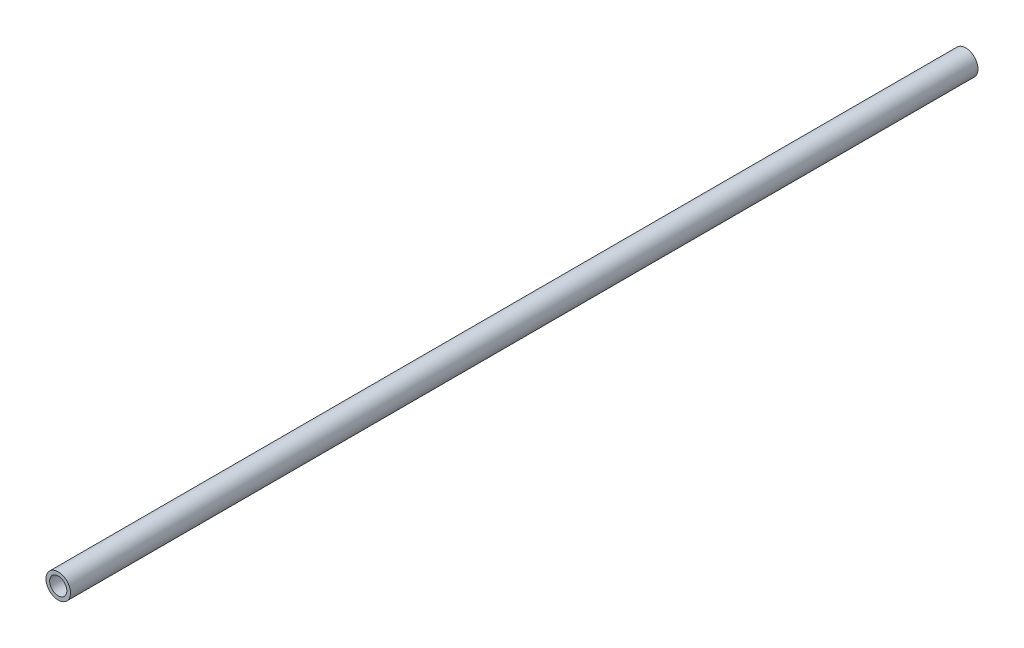
ISO-10303-21;
HEADER;
FILE_DESCRIPTION(('STEP AP214'),'2;1');
FILE_NAME('part.step','',(''),(''),'','','');
FILE_SCHEMA(('AUTOMOTIVE_DESIGN { 1 0 10303 214 1 1 1 1 }'));
ENDSEC;
DATA;
#1=APPLICATION_CONTEXT('core data for automotive mechanical design processes');
#2=APPLICATION_PROTOCOL_DEFINITION('international standard','automotive_design',2000,#1);
#3=PRODUCT_CONTEXT('',#1,'mechanical');
#4=PRODUCT('Part','Part','',(#3));
#5=PRODUCT_RELATED_PRODUCT_CATEGORY('part','',(#4));
#6=PRODUCT_DEFINITION_FORMATION('','',#4);
#7=PRODUCT_DEFINITION_CONTEXT('part definition',#1,'design');
#8=PRODUCT_DEFINITION('design','',#6,#7);
#9=PRODUCT_DEFINITION_SHAPE('','',#8);
#10=(LENGTH_UNIT() NAMED_UNIT(*) SI_UNIT(.MILLI.,.METRE.));
#11=(NAMED_UNIT(*) PLANE_ANGLE_UNIT() SI_UNIT($,.RADIAN.));
#12=(NAMED_UNIT(*) SI_UNIT($,.STERADIAN.) SOLID_ANGLE_UNIT());
#13=UNCERTAINTY_MEASURE_WITH_UNIT(LENGTH_MEASURE(1.E-05),#10,'distance_accuracy_value','');
#14=(GEOMETRIC_REPRESENTATION_CONTEXT(3) GLOBAL_UNCERTAINTY_ASSIGNED_CONTEXT((#13)) GLOBAL_UNIT_ASSIGNED_CONTEXT((#10,
#11,#12)) REPRESENTATION_CONTEXT('',''));
#15=CARTESIAN_POINT('',(0.,0.,0.));
#16=DIRECTION('',(0.,0.,1.));
#17=DIRECTION('',(1.,0.,0.));
#18=AXIS2_PLACEMENT_3D('',#15,#16,#17);
#19=CARTESIAN_POINT('',(0.,0.,185.));
#20=DIRECTION('',(0.,0.,1.));
#21=DIRECTION('',(1.,0.,0.));
#22=AXIS2_PLACEMENT_3D('',#19,#20,#21);
#23=PLANE('',#22);
#24=CARTESIAN_POINT('',(0.,0.,185.));
#25=DIRECTION('',(0.,0.,1.));
#26=DIRECTION('',(1.,0.,0.));
#27=AXIS2_PLACEMENT_3D('',#24,#25,#26);
#28=CIRCLE('',#27,5.);
#29=CARTESIAN_POINT('',(5.,0.,185.));
#30=VERTEX_POINT('',#29);
#31=EDGE_CURVE('E11',#30,#30,#28,.T.);
#32=ORIENTED_EDGE('',*,*,#31,.T.);
#33=EDGE_LOOP('',(#32));
#34=FACE_BOUND('',#33,.T.);
#35=CARTESIAN_POINT('',(0.,0.,185.));
#36=DIRECTION('',(0.,0.,1.));
#37=DIRECTION('',(1.,0.,0.));
#38=AXIS2_PLACEMENT_3D('',#35,#36,#37);
#39=CIRCLE('',#38,3.5);
#40=CARTESIAN_POINT('',(3.5,0.,185.));
#41=VERTEX_POINT('',#40);
#42=EDGE_CURVE('E60',#41,#41,#39,.T.);
#43=ORIENTED_EDGE('',*,*,#42,.F.);
#44=EDGE_LOOP('',(#43));
#45=FACE_BOUND('',#44,.T.);
#46=ADVANCED_FACE('F49',(#34,#45),#23,.T.);
#47=CARTESIAN_POINT('',(0.,0.,-185.));
#48=DIRECTION('',(0.,0.,1.));
#49=DIRECTION('',(1.,0.,0.));
#50=AXIS2_PLACEMENT_3D('',#47,#48,#49);
#51=PLANE('',#50);
#52=CARTESIAN_POINT('',(0.,0.,-185.));
#53=DIRECTION('',(0.,0.,1.));
#54=DIRECTION('',(1.,0.,0.));
#55=AXIS2_PLACEMENT_3D('',#52,#53,#54);
#56=CIRCLE('',#55,5.);
#57=CARTESIAN_POINT('',(5.,0.,-185.));
#58=VERTEX_POINT('',#57);
#59=EDGE_CURVE('E53',#58,#58,#56,.T.);
#60=ORIENTED_EDGE('',*,*,#59,.F.);
#61=EDGE_LOOP('',(#60));
#62=FACE_BOUND('',#61,.T.);
#63=CARTESIAN_POINT('',(0.,0.,-185.));
#64=DIRECTION('',(0.,0.,1.));
#65=DIRECTION('',(1.,0.,0.));
#66=AXIS2_PLACEMENT_3D('',#63,#64,#65);
#67=CIRCLE('',#66,3.5);
#68=CARTESIAN_POINT('',(3.5,0.,-185.));
#69=VERTEX_POINT('',#68);
#70=EDGE_CURVE('E62',#69,#69,#67,.T.);
#71=ORIENTED_EDGE('',*,*,#70,.T.);
#72=EDGE_LOOP('',(#71));
#73=FACE_BOUND('',#72,.T.);
#74=ADVANCED_FACE('F72',(#62,#73),#51,.F.);
#75=CARTESIAN_POINT('',(0.,0.,185.));
#76=DIRECTION('',(0.,0.,-1.));
#77=DIRECTION('',(-1.,0.,0.));
#78=AXIS2_PLACEMENT_3D('',#75,#76,#77);
#79=CYLINDRICAL_SURFACE('',#78,5.);
#80=ORIENTED_EDGE('',*,*,#31,.F.);
#81=EDGE_LOOP('',(#80));
#82=FACE_BOUND('',#81,.T.);
#83=ORIENTED_EDGE('',*,*,#59,.T.);
#84=EDGE_LOOP('',(#83));
#85=FACE_BOUND('',#84,.T.);
#86=ADVANCED_FACE('F51',(#82,#85),#79,.T.);
#87=CARTESIAN_POINT('',(0.,0.,185.));
#88=DIRECTION('',(0.,0.,-1.));
#89=DIRECTION('',(-1.,0.,0.));
#90=AXIS2_PLACEMENT_3D('',#87,#88,#89);
#91=CYLINDRICAL_SURFACE('',#90,3.5);
#92=ORIENTED_EDGE('',*,*,#42,.T.);
#93=EDGE_LOOP('',(#92));
#94=FACE_BOUND('',#93,.T.);
#95=ORIENTED_EDGE('',*,*,#70,.F.);
#96=EDGE_LOOP('',(#95));
#97=FACE_BOUND('',#96,.T.);
#98=ADVANCED_FACE('F68',(#94,#97),#91,.F.);
#99=CLOSED_SHELL('',(#46,#74,#86,#98));
#100=MANIFOLD_SOLID_BREP('B2',#99);
#101=ADVANCED_BREP_SHAPE_REPRESENTATION('',(#18,#100),#14);
#102=SHAPE_DEFINITION_REPRESENTATION(#9,#101);
ENDSEC;
END-ISO-10303-21;
